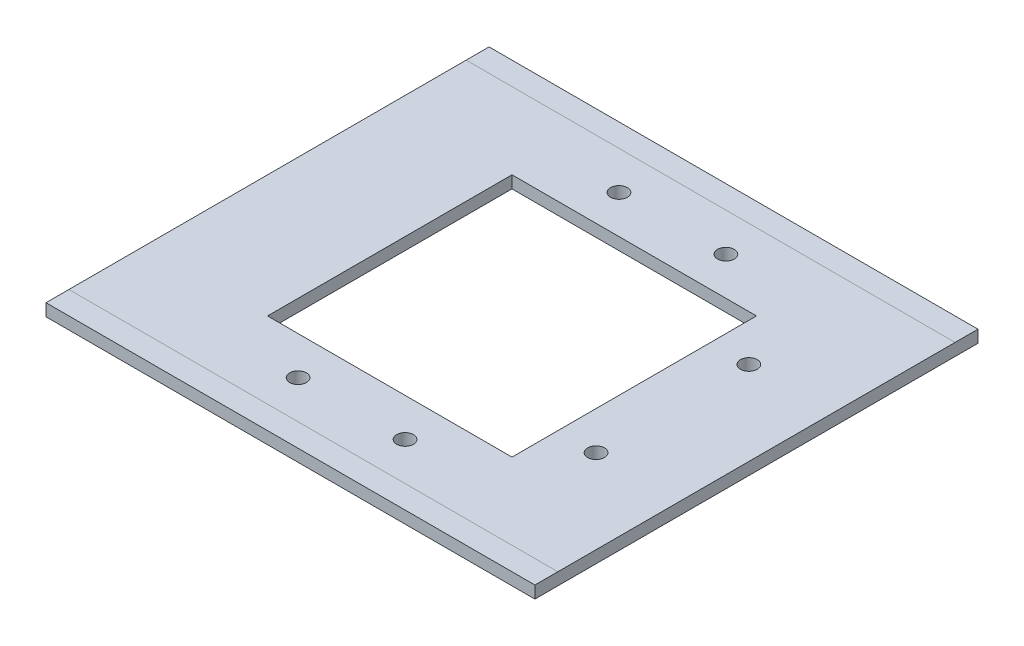
ISO-10303-21;
HEADER;
FILE_DESCRIPTION(('STEP AP214'),'2;1');
FILE_NAME('part.step','',(''),(''),'','','');
FILE_SCHEMA(('AUTOMOTIVE_DESIGN { 1 0 10303 214 1 1 1 1 }'));
ENDSEC;
DATA;
#1=APPLICATION_CONTEXT('core data for automotive mechanical design processes');
#2=APPLICATION_PROTOCOL_DEFINITION('international standard','automotive_design',2000,#1);
#3=PRODUCT_CONTEXT('',#1,'mechanical');
#4=PRODUCT('Part','Part','',(#3));
#5=PRODUCT_RELATED_PRODUCT_CATEGORY('part','',(#4));
#6=PRODUCT_DEFINITION_FORMATION('','',#4);
#7=PRODUCT_DEFINITION_CONTEXT('part definition',#1,'design');
#8=PRODUCT_DEFINITION('design','',#6,#7);
#9=PRODUCT_DEFINITION_SHAPE('','',#8);
#10=(LENGTH_UNIT() NAMED_UNIT(*) SI_UNIT(.MILLI.,.METRE.));
#11=(NAMED_UNIT(*) PLANE_ANGLE_UNIT() SI_UNIT($,.RADIAN.));
#12=(NAMED_UNIT(*) SI_UNIT($,.STERADIAN.) SOLID_ANGLE_UNIT());
#13=UNCERTAINTY_MEASURE_WITH_UNIT(LENGTH_MEASURE(1.E-05),#10,'distance_accuracy_value','');
#14=(GEOMETRIC_REPRESENTATION_CONTEXT(3) GLOBAL_UNCERTAINTY_ASSIGNED_CONTEXT((#13)) GLOBAL_UNIT_ASSIGNED_CONTEXT((#10,
#11,#12)) REPRESENTATION_CONTEXT('',''));
#15=CARTESIAN_POINT('',(0.,0.,0.));
#16=DIRECTION('',(0.,0.,1.));
#17=DIRECTION('',(1.,0.,0.));
#18=AXIS2_PLACEMENT_3D('',#15,#16,#17);
#19=CARTESIAN_POINT('',(0.,1.6,0.));
#20=DIRECTION('',(0.,1.,0.));
#21=DIRECTION('',(0.,0.,1.));
#22=AXIS2_PLACEMENT_3D('',#19,#20,#21);
#23=PLANE('',#22);
#24=DIRECTION('',(0.,0.,1.));
#25=VECTOR('',#24,1.);
#26=CARTESIAN_POINT('',(48.,1.6,-13.));
#27=LINE('',#26,#25);
#28=CARTESIAN_POINT('',(48.,1.6,-45.));
#29=VERTEX_POINT('',#28);
#30=CARTESIAN_POINT('',(48.,1.6,-13.));
#31=VERTEX_POINT('',#30);
#32=EDGE_CURVE('E150',#29,#31,#27,.T.);
#33=ORIENTED_EDGE('',*,*,#32,.T.);
#34=DIRECTION('',(-1.,0.,0.));
#35=VECTOR('',#34,1.);
#36=CARTESIAN_POINT('',(16.,1.6,-13.));
#37=LINE('',#36,#35);
#38=CARTESIAN_POINT('',(16.,1.6,-13.));
#39=VERTEX_POINT('',#38);
#40=EDGE_CURVE('E148',#31,#39,#37,.T.);
#41=ORIENTED_EDGE('',*,*,#40,.T.);
#42=DIRECTION('',(0.,0.,1.));
#43=VECTOR('',#42,1.);
#44=CARTESIAN_POINT('',(16.,1.6,-13.));
#45=LINE('',#44,#43);
#46=CARTESIAN_POINT('',(16.,1.6,-45.));
#47=VERTEX_POINT('',#46);
#48=EDGE_CURVE('E145',#47,#39,#45,.T.);
#49=ORIENTED_EDGE('',*,*,#48,.F.);
#50=DIRECTION('',(-1.,0.,0.));
#51=VECTOR('',#50,1.);
#52=CARTESIAN_POINT('',(16.,1.6,-45.));
#53=LINE('',#52,#51);
#54=EDGE_CURVE('E152',#29,#47,#53,.T.);
#55=ORIENTED_EDGE('',*,*,#54,.F.);
#56=EDGE_LOOP('',(#33,#41,#49,#55));
#57=FACE_BOUND('',#56,.T.);
#58=CARTESIAN_POINT('',(53.,1.6,-39.));
#59=DIRECTION('',(0.,1.,0.));
#60=DIRECTION('',(0.,0.,1.));
#61=AXIS2_PLACEMENT_3D('',#58,#59,#60);
#62=CIRCLE('',#61,1.1);
#63=CARTESIAN_POINT('',(53.,1.6,-37.9));
#64=VERTEX_POINT('',#63);
#65=EDGE_CURVE('E119',#64,#64,#62,.F.);
#66=ORIENTED_EDGE('',*,*,#65,.T.);
#67=EDGE_LOOP('',(#66));
#68=FACE_BOUND('',#67,.T.);
#69=CARTESIAN_POINT('',(25.,1.6,-8.));
#70=DIRECTION('',(0.,1.,0.));
#71=DIRECTION('',(0.,0.,1.));
#72=AXIS2_PLACEMENT_3D('',#69,#70,#71);
#73=CIRCLE('',#72,1.1);
#74=CARTESIAN_POINT('',(25.,1.6,-6.9));
#75=VERTEX_POINT('',#74);
#76=EDGE_CURVE('E121',#75,#75,#73,.F.);
#77=ORIENTED_EDGE('',*,*,#76,.T.);
#78=EDGE_LOOP('',(#77));
#79=FACE_BOUND('',#78,.T.);
#80=CARTESIAN_POINT('',(39.,1.6,-8.));
#81=DIRECTION('',(0.,1.,0.));
#82=DIRECTION('',(0.,0.,1.));
#83=AXIS2_PLACEMENT_3D('',#80,#81,#82);
#84=CIRCLE('',#83,1.1);
#85=CARTESIAN_POINT('',(39.,1.6,-6.9));
#86=VERTEX_POINT('',#85);
#87=EDGE_CURVE('E126',#86,#86,#84,.F.);
#88=ORIENTED_EDGE('',*,*,#87,.T.);
#89=EDGE_LOOP('',(#88));
#90=FACE_BOUND('',#89,.T.);
#91=CARTESIAN_POINT('',(39.,1.6,-50.));
#92=DIRECTION('',(0.,1.,0.));
#93=DIRECTION('',(0.,0.,1.));
#94=AXIS2_PLACEMENT_3D('',#91,#92,#93);
#95=CIRCLE('',#94,1.1);
#96=CARTESIAN_POINT('',(39.,1.6,-48.9));
#97=VERTEX_POINT('',#96);
#98=EDGE_CURVE('E136',#97,#97,#95,.F.);
#99=ORIENTED_EDGE('',*,*,#98,.T.);
#100=EDGE_LOOP('',(#99));
#101=FACE_BOUND('',#100,.T.);
#102=CARTESIAN_POINT('',(53.,1.6,-19.));
#103=DIRECTION('',(0.,1.,0.));
#104=DIRECTION('',(0.,0.,1.));
#105=AXIS2_PLACEMENT_3D('',#102,#103,#104);
#106=CIRCLE('',#105,1.1);
#107=CARTESIAN_POINT('',(53.,1.6,-17.9));
#108=VERTEX_POINT('',#107);
#109=EDGE_CURVE('E139',#108,#108,#106,.F.);
#110=ORIENTED_EDGE('',*,*,#109,.T.);
#111=EDGE_LOOP('',(#110));
#112=FACE_BOUND('',#111,.T.);
#113=CARTESIAN_POINT('',(25.,1.6,-50.));
#114=DIRECTION('',(0.,1.,0.));
#115=DIRECTION('',(0.,0.,1.));
#116=AXIS2_PLACEMENT_3D('',#113,#114,#115);
#117=CIRCLE('',#116,1.1);
#118=CARTESIAN_POINT('',(25.,1.6,-48.9));
#119=VERTEX_POINT('',#118);
#120=EDGE_CURVE('E142',#119,#119,#117,.F.);
#121=ORIENTED_EDGE('',*,*,#120,.T.);
#122=EDGE_LOOP('',(#121));
#123=FACE_BOUND('',#122,.T.);
#124=DIRECTION('',(0.,0.,-1.));
#125=VECTOR('',#124,1.);
#126=CARTESIAN_POINT('',(64.,1.6,-58.));
#127=LINE('',#126,#125);
#128=CARTESIAN_POINT('',(64.,1.6,-3.));
#129=VERTEX_POINT('',#128);
#130=CARTESIAN_POINT('',(64.,1.6,-55.));
#131=VERTEX_POINT('',#130);
#132=EDGE_CURVE('E131',#129,#131,#127,.T.);
#133=ORIENTED_EDGE('',*,*,#132,.T.);
#134=DIRECTION('',(-1.,0.,0.));
#135=VECTOR('',#134,1.);
#136=CARTESIAN_POINT('',(0.,1.6,-55.));
#137=LINE('',#136,#135);
#138=CARTESIAN_POINT('',(0.,1.6,-55.));
#139=VERTEX_POINT('',#138);
#140=EDGE_CURVE('E11',#131,#139,#137,.T.);
#141=ORIENTED_EDGE('',*,*,#140,.T.);
#142=DIRECTION('',(0.,0.,1.));
#143=VECTOR('',#142,1.);
#144=CARTESIAN_POINT('',(0.,1.6,-58.));
#145=LINE('',#144,#143);
#146=CARTESIAN_POINT('',(0.,1.6,-3.));
#147=VERTEX_POINT('',#146);
#148=EDGE_CURVE('E98',#139,#147,#145,.T.);
#149=ORIENTED_EDGE('',*,*,#148,.T.);
#150=DIRECTION('',(-1.,0.,0.));
#151=VECTOR('',#150,1.);
#152=CARTESIAN_POINT('',(0.,1.6,-3.));
#153=LINE('',#152,#151);
#154=EDGE_CURVE('E24',#129,#147,#153,.T.);
#155=ORIENTED_EDGE('',*,*,#154,.F.);
#156=EDGE_LOOP('',(#133,#141,#149,#155));
#157=FACE_BOUND('',#156,.T.);
#158=ADVANCED_FACE('F16',(#57,#68,#79,#90,#101,#112,#123,#157),#23,.T.);
#159=CARTESIAN_POINT('',(64.,1.6,0.));
#160=VERTEX_POINT('',#159);
#161=EDGE_CURVE('E128',#160,#129,#127,.T.);
#162=ORIENTED_EDGE('',*,*,#161,.T.);
#163=ORIENTED_EDGE('',*,*,#154,.T.);
#164=CARTESIAN_POINT('',(0.,1.6,0.));
#165=VERTEX_POINT('',#164);
#166=EDGE_CURVE('E90',#147,#165,#145,.T.);
#167=ORIENTED_EDGE('',*,*,#166,.T.);
#168=DIRECTION('',(1.,0.,0.));
#169=VECTOR('',#168,1.);
#170=CARTESIAN_POINT('',(0.,1.6,0.));
#171=LINE('',#170,#169);
#172=EDGE_CURVE('E94',#165,#160,#171,.T.);
#173=ORIENTED_EDGE('',*,*,#172,.T.);
#174=EDGE_LOOP('',(#162,#163,#167,#173));
#175=FACE_BOUND('',#174,.T.);
#176=ADVANCED_FACE('F93',(#175),#23,.T.);
#177=CARTESIAN_POINT('',(0.,2.,-58.));
#178=DIRECTION('',(1.,0.,0.));
#179=DIRECTION('',(0.,0.,-1.));
#180=AXIS2_PLACEMENT_3D('',#177,#178,#179);
#181=PLANE('',#180);
#182=CARTESIAN_POINT('',(0.,1.6,-58.));
#183=VERTEX_POINT('',#182);
#184=EDGE_CURVE('E100',#183,#139,#145,.T.);
#185=ORIENTED_EDGE('',*,*,#184,.F.);
#186=DIRECTION('',(0.,-1.,0.));
#187=VECTOR('',#186,1.);
#188=CARTESIAN_POINT('',(0.,2.,-58.));
#189=LINE('',#188,#187);
#190=CARTESIAN_POINT('',(0.,0.,-58.));
#191=VERTEX_POINT('',#190);
#192=EDGE_CURVE('E204',#183,#191,#189,.T.);
#193=ORIENTED_EDGE('',*,*,#192,.T.);
#194=DIRECTION('',(0.,0.,1.));
#195=VECTOR('',#194,1.);
#196=CARTESIAN_POINT('',(0.,0.,-58.));
#197=LINE('',#196,#195);
#198=CARTESIAN_POINT('',(0.,0.,0.));
#199=VERTEX_POINT('',#198);
#200=EDGE_CURVE('E113',#191,#199,#197,.T.);
#201=ORIENTED_EDGE('',*,*,#200,.T.);
#202=DIRECTION('',(0.,-1.,0.));
#203=VECTOR('',#202,1.);
#204=CARTESIAN_POINT('',(0.,2.,0.));
#205=LINE('',#204,#203);
#206=EDGE_CURVE('E105',#165,#199,#205,.T.);
#207=ORIENTED_EDGE('',*,*,#206,.F.);
#208=ORIENTED_EDGE('',*,*,#166,.F.);
#209=ORIENTED_EDGE('',*,*,#148,.F.);
#210=EDGE_LOOP('',(#185,#193,#201,#207,#208,#209));
#211=FACE_BOUND('',#210,.T.);
#212=ADVANCED_FACE('F18',(#211),#181,.F.);
#213=CARTESIAN_POINT('',(0.,2.,0.));
#214=DIRECTION('',(0.,0.,-1.));
#215=DIRECTION('',(-1.,0.,0.));
#216=AXIS2_PLACEMENT_3D('',#213,#214,#215);
#217=PLANE('',#216);
#218=ORIENTED_EDGE('',*,*,#172,.F.);
#219=ORIENTED_EDGE('',*,*,#206,.T.);
#220=DIRECTION('',(1.,0.,0.));
#221=VECTOR('',#220,1.);
#222=CARTESIAN_POINT('',(0.,0.,0.));
#223=LINE('',#222,#221);
#224=CARTESIAN_POINT('',(64.,0.,0.));
#225=VERTEX_POINT('',#224);
#226=EDGE_CURVE('E196',#199,#225,#223,.T.);
#227=ORIENTED_EDGE('',*,*,#226,.T.);
#228=DIRECTION('',(0.,-1.,0.));
#229=VECTOR('',#228,1.);
#230=CARTESIAN_POINT('',(64.,2.,0.));
#231=LINE('',#230,#229);
#232=EDGE_CURVE('E107',#160,#225,#231,.T.);
#233=ORIENTED_EDGE('',*,*,#232,.F.);
#234=EDGE_LOOP('',(#218,#219,#227,#233));
#235=FACE_BOUND('',#234,.T.);
#236=ADVANCED_FACE('F103',(#235),#217,.F.);
#237=CARTESIAN_POINT('',(64.,2.,-58.));
#238=DIRECTION('',(-1.,0.,0.));
#239=DIRECTION('',(0.,0.,1.));
#240=AXIS2_PLACEMENT_3D('',#237,#238,#239);
#241=PLANE('',#240);
#242=ORIENTED_EDGE('',*,*,#161,.F.);
#243=ORIENTED_EDGE('',*,*,#232,.T.);
#244=DIRECTION('',(0.,0.,-1.));
#245=VECTOR('',#244,1.);
#246=CARTESIAN_POINT('',(64.,0.,-58.));
#247=LINE('',#246,#245);
#248=CARTESIAN_POINT('',(64.,0.,-58.));
#249=VERTEX_POINT('',#248);
#250=EDGE_CURVE('E198',#225,#249,#247,.T.);
#251=ORIENTED_EDGE('',*,*,#250,.T.);
#252=DIRECTION('',(0.,-1.,0.));
#253=VECTOR('',#252,1.);
#254=CARTESIAN_POINT('',(64.,2.,-58.));
#255=LINE('',#254,#253);
#256=CARTESIAN_POINT('',(64.,1.6,-58.));
#257=VERTEX_POINT('',#256);
#258=EDGE_CURVE('E115',#257,#249,#255,.T.);
#259=ORIENTED_EDGE('',*,*,#258,.F.);
#260=EDGE_CURVE('E108',#131,#257,#127,.T.);
#261=ORIENTED_EDGE('',*,*,#260,.F.);
#262=ORIENTED_EDGE('',*,*,#132,.F.);
#263=EDGE_LOOP('',(#242,#243,#251,#259,#261,#262));
#264=FACE_BOUND('',#263,.T.);
#265=ADVANCED_FACE('F212',(#264),#241,.F.);
#266=CARTESIAN_POINT('',(0.,2.,-58.));
#267=DIRECTION('',(0.,0.,1.));
#268=DIRECTION('',(1.,0.,0.));
#269=AXIS2_PLACEMENT_3D('',#266,#267,#268);
#270=PLANE('',#269);
#271=DIRECTION('',(-1.,0.,0.));
#272=VECTOR('',#271,1.);
#273=CARTESIAN_POINT('',(0.,1.6,-58.));
#274=LINE('',#273,#272);
#275=EDGE_CURVE('E122',#257,#183,#274,.T.);
#276=ORIENTED_EDGE('',*,*,#275,.F.);
#277=ORIENTED_EDGE('',*,*,#258,.T.);
#278=DIRECTION('',(-1.,0.,0.));
#279=VECTOR('',#278,1.);
#280=CARTESIAN_POINT('',(0.,0.,-58.));
#281=LINE('',#280,#279);
#282=EDGE_CURVE('E201',#249,#191,#281,.T.);
#283=ORIENTED_EDGE('',*,*,#282,.T.);
#284=ORIENTED_EDGE('',*,*,#192,.F.);
#285=EDGE_LOOP('',(#276,#277,#283,#284));
#286=FACE_BOUND('',#285,.T.);
#287=ADVANCED_FACE('F207',(#286),#270,.F.);
#288=CARTESIAN_POINT('',(16.,0.,-45.));
#289=DIRECTION('',(0.,0.,1.));
#290=DIRECTION('',(1.,0.,0.));
#291=AXIS2_PLACEMENT_3D('',#288,#289,#290);
#292=PLANE('',#291);
#293=DIRECTION('',(0.,1.,0.));
#294=VECTOR('',#293,1.);
#295=CARTESIAN_POINT('',(48.,0.,-45.));
#296=LINE('',#295,#294);
#297=CARTESIAN_POINT('',(48.,0.,-45.));
#298=VERTEX_POINT('',#297);
#299=EDGE_CURVE('E192',#298,#29,#296,.T.);
#300=ORIENTED_EDGE('',*,*,#299,.T.);
#301=ORIENTED_EDGE('',*,*,#54,.T.);
#302=DIRECTION('',(0.,1.,0.));
#303=VECTOR('',#302,1.);
#304=CARTESIAN_POINT('',(16.,0.,-45.));
#305=LINE('',#304,#303);
#306=CARTESIAN_POINT('',(16.,0.,-45.));
#307=VERTEX_POINT('',#306);
#308=EDGE_CURVE('E183',#307,#47,#305,.T.);
#309=ORIENTED_EDGE('',*,*,#308,.F.);
#310=DIRECTION('',(1.,0.,0.));
#311=VECTOR('',#310,1.);
#312=CARTESIAN_POINT('',(16.,0.,-45.));
#313=LINE('',#312,#311);
#314=EDGE_CURVE('E173',#307,#298,#313,.T.);
#315=ORIENTED_EDGE('',*,*,#314,.T.);
#316=EDGE_LOOP('',(#300,#301,#309,#315));
#317=FACE_BOUND('',#316,.T.);
#318=ADVANCED_FACE('F227',(#317),#292,.T.);
#319=CARTESIAN_POINT('',(48.,0.,-13.));
#320=DIRECTION('',(1.,0.,0.));
#321=DIRECTION('',(0.,0.,-1.));
#322=AXIS2_PLACEMENT_3D('',#319,#320,#321);
#323=PLANE('',#322);
#324=ORIENTED_EDGE('',*,*,#32,.F.);
#325=ORIENTED_EDGE('',*,*,#299,.F.);
#326=DIRECTION('',(0.,0.,-1.));
#327=VECTOR('',#326,1.);
#328=CARTESIAN_POINT('',(48.,0.,-13.));
#329=LINE('',#328,#327);
#330=CARTESIAN_POINT('',(48.,0.,-13.));
#331=VERTEX_POINT('',#330);
#332=EDGE_CURVE('E175',#331,#298,#329,.T.);
#333=ORIENTED_EDGE('',*,*,#332,.F.);
#334=DIRECTION('',(0.,1.,0.));
#335=VECTOR('',#334,1.);
#336=CARTESIAN_POINT('',(48.,0.,-13.));
#337=LINE('',#336,#335);
#338=EDGE_CURVE('E189',#331,#31,#337,.T.);
#339=ORIENTED_EDGE('',*,*,#338,.T.);
#340=EDGE_LOOP('',(#324,#325,#333,#339));
#341=FACE_BOUND('',#340,.T.);
#342=ADVANCED_FACE('F230',(#341),#323,.F.);
#343=CARTESIAN_POINT('',(16.,0.,-13.));
#344=DIRECTION('',(0.,0.,1.));
#345=DIRECTION('',(1.,0.,0.));
#346=AXIS2_PLACEMENT_3D('',#343,#344,#345);
#347=PLANE('',#346);
#348=ORIENTED_EDGE('',*,*,#40,.F.);
#349=ORIENTED_EDGE('',*,*,#338,.F.);
#350=DIRECTION('',(1.,0.,0.));
#351=VECTOR('',#350,1.);
#352=CARTESIAN_POINT('',(16.,0.,-13.));
#353=LINE('',#352,#351);
#354=CARTESIAN_POINT('',(16.,0.,-13.));
#355=VERTEX_POINT('',#354);
#356=EDGE_CURVE('E178',#355,#331,#353,.T.);
#357=ORIENTED_EDGE('',*,*,#356,.F.);
#358=DIRECTION('',(0.,1.,0.));
#359=VECTOR('',#358,1.);
#360=CARTESIAN_POINT('',(16.,0.,-13.));
#361=LINE('',#360,#359);
#362=EDGE_CURVE('E186',#355,#39,#361,.T.);
#363=ORIENTED_EDGE('',*,*,#362,.T.);
#364=EDGE_LOOP('',(#348,#349,#357,#363));
#365=FACE_BOUND('',#364,.T.);
#366=ADVANCED_FACE('F234',(#365),#347,.F.);
#367=CARTESIAN_POINT('',(16.,0.,-13.));
#368=DIRECTION('',(1.,0.,0.));
#369=DIRECTION('',(0.,0.,-1.));
#370=AXIS2_PLACEMENT_3D('',#367,#368,#369);
#371=PLANE('',#370);
#372=ORIENTED_EDGE('',*,*,#308,.T.);
#373=ORIENTED_EDGE('',*,*,#48,.T.);
#374=ORIENTED_EDGE('',*,*,#362,.F.);
#375=DIRECTION('',(0.,0.,-1.));
#376=VECTOR('',#375,1.);
#377=CARTESIAN_POINT('',(16.,0.,-13.));
#378=LINE('',#377,#376);
#379=EDGE_CURVE('E181',#355,#307,#378,.T.);
#380=ORIENTED_EDGE('',*,*,#379,.T.);
#381=EDGE_LOOP('',(#372,#373,#374,#380));
#382=FACE_BOUND('',#381,.T.);
#383=ADVANCED_FACE('F237',(#382),#371,.T.);
#384=CARTESIAN_POINT('',(25.,0.,-50.));
#385=DIRECTION('',(0.,1.,0.));
#386=DIRECTION('',(0.,0.,1.));
#387=AXIS2_PLACEMENT_3D('',#384,#385,#386);
#388=CYLINDRICAL_SURFACE('',#387,1.1);
#389=CARTESIAN_POINT('',(25.,0.,-50.));
#390=DIRECTION('',(0.,1.,0.));
#391=DIRECTION('',(0.,0.,1.));
#392=AXIS2_PLACEMENT_3D('',#389,#390,#391);
#393=CIRCLE('',#392,1.1);
#394=CARTESIAN_POINT('',(25.,0.,-48.9));
#395=VERTEX_POINT('',#394);
#396=EDGE_CURVE('E168',#395,#395,#393,.T.);
#397=ORIENTED_EDGE('',*,*,#396,.F.);
#398=EDGE_LOOP('',(#397));
#399=FACE_BOUND('',#398,.T.);
#400=ORIENTED_EDGE('',*,*,#120,.F.);
#401=EDGE_LOOP('',(#400));
#402=FACE_BOUND('',#401,.T.);
#403=ADVANCED_FACE('F239',(#399,#402),#388,.F.);
#404=CARTESIAN_POINT('',(53.,0.,-19.));
#405=DIRECTION('',(0.,1.,0.));
#406=DIRECTION('',(0.,0.,1.));
#407=AXIS2_PLACEMENT_3D('',#404,#405,#406);
#408=CYLINDRICAL_SURFACE('',#407,1.1);
#409=CARTESIAN_POINT('',(53.,0.,-19.));
#410=DIRECTION('',(0.,1.,0.));
#411=DIRECTION('',(0.,0.,-1.));
#412=AXIS2_PLACEMENT_3D('',#409,#410,#411);
#413=CIRCLE('',#412,1.1);
#414=CARTESIAN_POINT('',(53.,0.,-20.1));
#415=VERTEX_POINT('',#414);
#416=EDGE_CURVE('E155',#415,#415,#413,.T.);
#417=ORIENTED_EDGE('',*,*,#416,.F.);
#418=EDGE_LOOP('',(#417));
#419=FACE_BOUND('',#418,.T.);
#420=ORIENTED_EDGE('',*,*,#109,.F.);
#421=EDGE_LOOP('',(#420));
#422=FACE_BOUND('',#421,.T.);
#423=ADVANCED_FACE('F247',(#419,#422),#408,.F.);
#424=CARTESIAN_POINT('',(39.,0.,-50.));
#425=DIRECTION('',(0.,1.,0.));
#426=DIRECTION('',(0.,0.,1.));
#427=AXIS2_PLACEMENT_3D('',#424,#425,#426);
#428=CYLINDRICAL_SURFACE('',#427,1.1);
#429=CARTESIAN_POINT('',(39.,0.,-50.));
#430=DIRECTION('',(0.,1.,0.));
#431=DIRECTION('',(0.,0.,-1.));
#432=AXIS2_PLACEMENT_3D('',#429,#430,#431);
#433=CIRCLE('',#432,1.1);
#434=CARTESIAN_POINT('',(39.,0.,-51.1));
#435=VERTEX_POINT('',#434);
#436=EDGE_CURVE('E165',#435,#435,#433,.T.);
#437=ORIENTED_EDGE('',*,*,#436,.F.);
#438=EDGE_LOOP('',(#437));
#439=FACE_BOUND('',#438,.T.);
#440=ORIENTED_EDGE('',*,*,#98,.F.);
#441=EDGE_LOOP('',(#440));
#442=FACE_BOUND('',#441,.T.);
#443=ADVANCED_FACE('F295',(#439,#442),#428,.F.);
#444=CARTESIAN_POINT('',(39.,0.,-8.));
#445=DIRECTION('',(0.,1.,0.));
#446=DIRECTION('',(0.,0.,1.));
#447=AXIS2_PLACEMENT_3D('',#444,#445,#446);
#448=CYLINDRICAL_SURFACE('',#447,1.1);
#449=CARTESIAN_POINT('',(39.,0.,-8.));
#450=DIRECTION('',(0.,1.,0.));
#451=DIRECTION('',(0.,0.,1.));
#452=AXIS2_PLACEMENT_3D('',#449,#450,#451);
#453=CIRCLE('',#452,1.1);
#454=CARTESIAN_POINT('',(39.,0.,-6.9));
#455=VERTEX_POINT('',#454);
#456=EDGE_CURVE('E162',#455,#455,#453,.T.);
#457=ORIENTED_EDGE('',*,*,#456,.F.);
#458=EDGE_LOOP('',(#457));
#459=FACE_BOUND('',#458,.T.);
#460=ORIENTED_EDGE('',*,*,#87,.F.);
#461=EDGE_LOOP('',(#460));
#462=FACE_BOUND('',#461,.T.);
#463=ADVANCED_FACE('F286',(#459,#462),#448,.F.);
#464=CARTESIAN_POINT('',(25.,0.,-8.));
#465=DIRECTION('',(0.,1.,0.));
#466=DIRECTION('',(0.,0.,1.));
#467=AXIS2_PLACEMENT_3D('',#464,#465,#466);
#468=CYLINDRICAL_SURFACE('',#467,1.1);
#469=CARTESIAN_POINT('',(25.,0.,-8.));
#470=DIRECTION('',(0.,1.,0.));
#471=DIRECTION('',(0.,0.,-1.));
#472=AXIS2_PLACEMENT_3D('',#469,#470,#471);
#473=CIRCLE('',#472,1.1);
#474=CARTESIAN_POINT('',(25.,0.,-9.1));
#475=VERTEX_POINT('',#474);
#476=EDGE_CURVE('E159',#475,#475,#473,.T.);
#477=ORIENTED_EDGE('',*,*,#476,.F.);
#478=EDGE_LOOP('',(#477));
#479=FACE_BOUND('',#478,.T.);
#480=ORIENTED_EDGE('',*,*,#76,.F.);
#481=EDGE_LOOP('',(#480));
#482=FACE_BOUND('',#481,.T.);
#483=ADVANCED_FACE('F277',(#479,#482),#468,.F.);
#484=CARTESIAN_POINT('',(53.,0.,-39.));
#485=DIRECTION('',(0.,1.,0.));
#486=DIRECTION('',(0.,0.,1.));
#487=AXIS2_PLACEMENT_3D('',#484,#485,#486);
#488=CYLINDRICAL_SURFACE('',#487,1.1);
#489=CARTESIAN_POINT('',(53.,0.,-39.));
#490=DIRECTION('',(0.,1.,0.));
#491=DIRECTION('',(0.,0.,1.));
#492=AXIS2_PLACEMENT_3D('',#489,#490,#491);
#493=CIRCLE('',#492,1.1);
#494=CARTESIAN_POINT('',(53.,0.,-37.9));
#495=VERTEX_POINT('',#494);
#496=EDGE_CURVE('E158',#495,#495,#493,.T.);
#497=ORIENTED_EDGE('',*,*,#496,.F.);
#498=EDGE_LOOP('',(#497));
#499=FACE_BOUND('',#498,.T.);
#500=ORIENTED_EDGE('',*,*,#65,.F.);
#501=EDGE_LOOP('',(#500));
#502=FACE_BOUND('',#501,.T.);
#503=ADVANCED_FACE('F218',(#499,#502),#488,.F.);
#504=CARTESIAN_POINT('',(0.,0.,0.));
#505=DIRECTION('',(0.,1.,0.));
#506=DIRECTION('',(0.,0.,1.));
#507=AXIS2_PLACEMENT_3D('',#504,#505,#506);
#508=PLANE('',#507);
#509=ORIENTED_EDGE('',*,*,#496,.T.);
#510=EDGE_LOOP('',(#509));
#511=FACE_BOUND('',#510,.T.);
#512=ORIENTED_EDGE('',*,*,#476,.T.);
#513=EDGE_LOOP('',(#512));
#514=FACE_BOUND('',#513,.T.);
#515=ORIENTED_EDGE('',*,*,#456,.T.);
#516=EDGE_LOOP('',(#515));
#517=FACE_BOUND('',#516,.T.);
#518=ORIENTED_EDGE('',*,*,#436,.T.);
#519=EDGE_LOOP('',(#518));
#520=FACE_BOUND('',#519,.T.);
#521=ORIENTED_EDGE('',*,*,#416,.T.);
#522=EDGE_LOOP('',(#521));
#523=FACE_BOUND('',#522,.T.);
#524=ORIENTED_EDGE('',*,*,#396,.T.);
#525=EDGE_LOOP('',(#524));
#526=FACE_BOUND('',#525,.T.);
#527=ORIENTED_EDGE('',*,*,#200,.F.);
#528=ORIENTED_EDGE('',*,*,#282,.F.);
#529=ORIENTED_EDGE('',*,*,#250,.F.);
#530=ORIENTED_EDGE('',*,*,#226,.F.);
#531=EDGE_LOOP('',(#527,#528,#529,#530));
#532=FACE_BOUND('',#531,.T.);
#533=ORIENTED_EDGE('',*,*,#314,.F.);
#534=ORIENTED_EDGE('',*,*,#379,.F.);
#535=ORIENTED_EDGE('',*,*,#356,.T.);
#536=ORIENTED_EDGE('',*,*,#332,.T.);
#537=EDGE_LOOP('',(#533,#534,#535,#536));
#538=FACE_BOUND('',#537,.T.);
#539=ADVANCED_FACE('F214',(#511,#514,#517,#520,#523,#526,#532,#538),#508,.F.);
#540=ORIENTED_EDGE('',*,*,#140,.F.);
#541=ORIENTED_EDGE('',*,*,#260,.T.);
#542=ORIENTED_EDGE('',*,*,#275,.T.);
#543=ORIENTED_EDGE('',*,*,#184,.T.);
#544=EDGE_LOOP('',(#540,#541,#542,#543));
#545=FACE_BOUND('',#544,.T.);
#546=ADVANCED_FACE('F217',(#545),#23,.T.);
#547=CLOSED_SHELL('',(#158,#176,#212,#236,#265,#287,#318,#342,#366,#383,#403,#423,#443,#463,
#483,#503,#539,#546));
#548=MANIFOLD_SOLID_BREP('B1',#547);
#549=ADVANCED_BREP_SHAPE_REPRESENTATION('',(#18,#548),#14);
#550=SHAPE_DEFINITION_REPRESENTATION(#9,#549);
ENDSEC;
END-ISO-10303-21;
